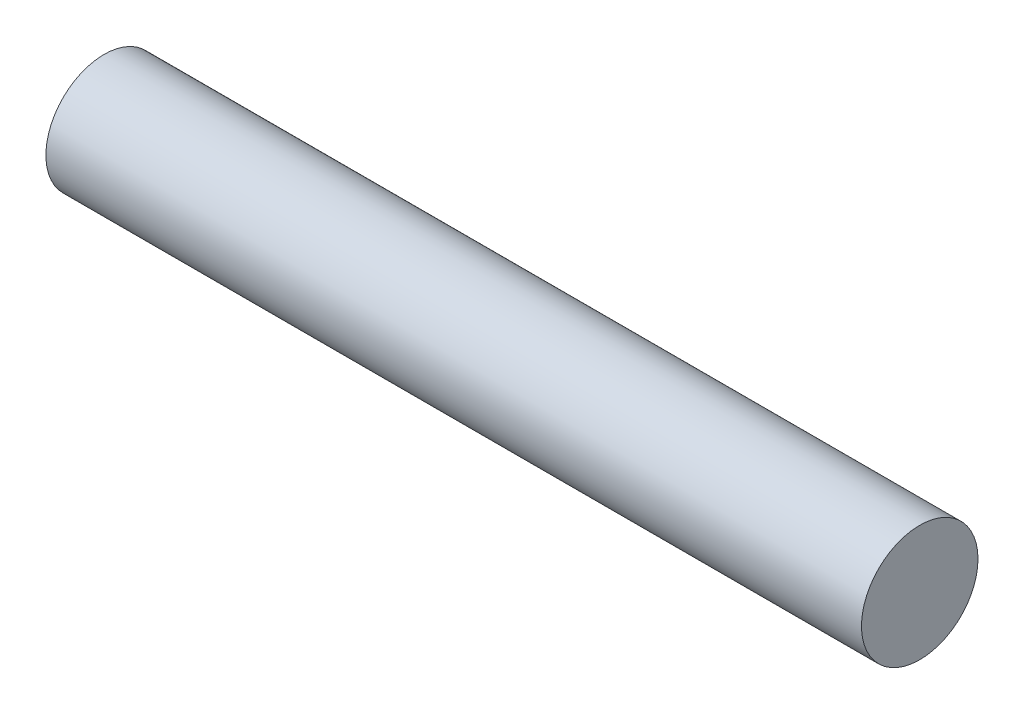
ISO-10303-21;
HEADER;
FILE_DESCRIPTION(('STEP AP214'),'2;1');
FILE_NAME('part.step','',(''),(''),'','','');
FILE_SCHEMA(('AUTOMOTIVE_DESIGN { 1 0 10303 214 1 1 1 1 }'));
ENDSEC;
DATA;
#1=APPLICATION_CONTEXT('core data for automotive mechanical design processes');
#2=APPLICATION_PROTOCOL_DEFINITION('international standard','automotive_design',2000,#1);
#3=PRODUCT_CONTEXT('',#1,'mechanical');
#4=PRODUCT('Part','Part','',(#3));
#5=PRODUCT_RELATED_PRODUCT_CATEGORY('part','',(#4));
#6=PRODUCT_DEFINITION_FORMATION('','',#4);
#7=PRODUCT_DEFINITION_CONTEXT('part definition',#1,'design');
#8=PRODUCT_DEFINITION('design','',#6,#7);
#9=PRODUCT_DEFINITION_SHAPE('','',#8);
#10=(LENGTH_UNIT() NAMED_UNIT(*) SI_UNIT(.MILLI.,.METRE.));
#11=(NAMED_UNIT(*) PLANE_ANGLE_UNIT() SI_UNIT($,.RADIAN.));
#12=(NAMED_UNIT(*) SI_UNIT($,.STERADIAN.) SOLID_ANGLE_UNIT());
#13=UNCERTAINTY_MEASURE_WITH_UNIT(LENGTH_MEASURE(1.E-05),#10,'distance_accuracy_value','');
#14=(GEOMETRIC_REPRESENTATION_CONTEXT(3) GLOBAL_UNCERTAINTY_ASSIGNED_CONTEXT((#13)) GLOBAL_UNIT_ASSIGNED_CONTEXT((#10,
#11,#12)) REPRESENTATION_CONTEXT('',''));
#15=CARTESIAN_POINT('',(0.,0.,0.));
#16=DIRECTION('',(0.,0.,1.));
#17=DIRECTION('',(1.,0.,0.));
#18=AXIS2_PLACEMENT_3D('',#15,#16,#17);
#19=CARTESIAN_POINT('',(14.,0.,0.));
#20=DIRECTION('',(-1.,0.,0.));
#21=DIRECTION('',(0.,0.,1.));
#22=AXIS2_PLACEMENT_3D('',#19,#20,#21);
#23=CYLINDRICAL_SURFACE('',#22,1.);
#24=CARTESIAN_POINT('',(14.,0.,0.));
#25=DIRECTION('',(1.,0.,0.));
#26=DIRECTION('',(0.,0.,-1.));
#27=AXIS2_PLACEMENT_3D('',#24,#25,#26);
#28=CIRCLE('',#27,1.);
#29=CARTESIAN_POINT('',(14.,0.,-1.));
#30=VERTEX_POINT('',#29);
#31=EDGE_CURVE('E10',#30,#30,#28,.T.);
#32=ORIENTED_EDGE('',*,*,#31,.F.);
#33=EDGE_LOOP('',(#32));
#34=FACE_BOUND('',#33,.T.);
#35=CARTESIAN_POINT('',(0.,0.,0.));
#36=DIRECTION('',(1.,0.,0.));
#37=DIRECTION('',(0.,0.,-1.));
#38=AXIS2_PLACEMENT_3D('',#35,#36,#37);
#39=CIRCLE('',#38,1.);
#40=CARTESIAN_POINT('',(0.,0.,-1.));
#41=VERTEX_POINT('',#40);
#42=EDGE_CURVE('E37',#41,#41,#39,.T.);
#43=ORIENTED_EDGE('',*,*,#42,.T.);
#44=EDGE_LOOP('',(#43));
#45=FACE_BOUND('',#44,.T.);
#46=ADVANCED_FACE('F34',(#34,#45),#23,.T.);
#47=CARTESIAN_POINT('',(14.,0.,0.));
#48=DIRECTION('',(1.,0.,0.));
#49=DIRECTION('',(0.,0.,-1.));
#50=AXIS2_PLACEMENT_3D('',#47,#48,#49);
#51=PLANE('',#50);
#52=ORIENTED_EDGE('',*,*,#31,.T.);
#53=EDGE_LOOP('',(#52));
#54=FACE_BOUND('',#53,.T.);
#55=ADVANCED_FACE('F49',(#54),#51,.T.);
#56=CARTESIAN_POINT('',(0.,0.,0.));
#57=DIRECTION('',(1.,0.,0.));
#58=DIRECTION('',(0.,0.,-1.));
#59=AXIS2_PLACEMENT_3D('',#56,#57,#58);
#60=PLANE('',#59);
#61=ORIENTED_EDGE('',*,*,#42,.F.);
#62=EDGE_LOOP('',(#61));
#63=FACE_BOUND('',#62,.T.);
#64=ADVANCED_FACE('F47',(#63),#60,.F.);
#65=CLOSED_SHELL('',(#46,#55,#64));
#66=MANIFOLD_SOLID_BREP('B2',#65);
#67=ADVANCED_BREP_SHAPE_REPRESENTATION('',(#18,#66),#14);
#68=SHAPE_DEFINITION_REPRESENTATION(#9,#67);
ENDSEC;
END-ISO-10303-21;
